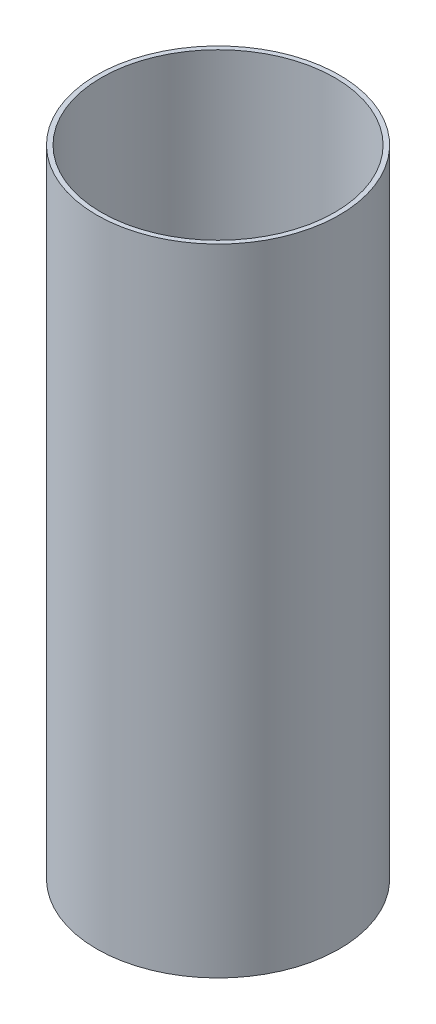
ISO-10303-21;
HEADER;
FILE_DESCRIPTION(('STEP AP214'),'2;1');
FILE_NAME('part.step','',(''),(''),'','','');
FILE_SCHEMA(('AUTOMOTIVE_DESIGN { 1 0 10303 214 1 1 1 1 }'));
ENDSEC;
DATA;
#1=APPLICATION_CONTEXT('core data for automotive mechanical design processes');
#2=APPLICATION_PROTOCOL_DEFINITION('international standard','automotive_design',2000,#1);
#3=PRODUCT_CONTEXT('',#1,'mechanical');
#4=PRODUCT('Part','Part','',(#3));
#5=PRODUCT_RELATED_PRODUCT_CATEGORY('part','',(#4));
#6=PRODUCT_DEFINITION_FORMATION('','',#4);
#7=PRODUCT_DEFINITION_CONTEXT('part definition',#1,'design');
#8=PRODUCT_DEFINITION('design','',#6,#7);
#9=PRODUCT_DEFINITION_SHAPE('','',#8);
#10=(LENGTH_UNIT() NAMED_UNIT(*) SI_UNIT(.MILLI.,.METRE.));
#11=(NAMED_UNIT(*) PLANE_ANGLE_UNIT() SI_UNIT($,.RADIAN.));
#12=(NAMED_UNIT(*) SI_UNIT($,.STERADIAN.) SOLID_ANGLE_UNIT());
#13=UNCERTAINTY_MEASURE_WITH_UNIT(LENGTH_MEASURE(1.E-05),#10,'distance_accuracy_value','');
#14=(GEOMETRIC_REPRESENTATION_CONTEXT(3) GLOBAL_UNCERTAINTY_ASSIGNED_CONTEXT((#13)) GLOBAL_UNIT_ASSIGNED_CONTEXT((#10,
#11,#12)) REPRESENTATION_CONTEXT('',''));
#15=CARTESIAN_POINT('',(0.,0.,0.));
#16=DIRECTION('',(0.,0.,1.));
#17=DIRECTION('',(1.,0.,0.));
#18=AXIS2_PLACEMENT_3D('',#15,#16,#17);
#19=CARTESIAN_POINT('',(0.,275.,0.));
#20=DIRECTION('',(0.,1.,0.));
#21=DIRECTION('',(0.,0.,1.));
#22=AXIS2_PLACEMENT_3D('',#19,#20,#21);
#23=PLANE('',#22);
#24=CARTESIAN_POINT('',(0.,275.,0.));
#25=DIRECTION('',(0.,1.,0.));
#26=DIRECTION('',(0.,0.,1.));
#27=AXIS2_PLACEMENT_3D('',#24,#25,#26);
#28=CIRCLE('',#27,52.5);
#29=CARTESIAN_POINT('',(0.,275.,52.5));
#30=VERTEX_POINT('',#29);
#31=EDGE_CURVE('E10',#30,#30,#28,.T.);
#32=ORIENTED_EDGE('',*,*,#31,.T.);
#33=EDGE_LOOP('',(#32));
#34=FACE_BOUND('',#33,.T.);
#35=CARTESIAN_POINT('',(0.,275.,0.));
#36=DIRECTION('',(0.,1.,0.));
#37=DIRECTION('',(0.,0.,1.));
#38=AXIS2_PLACEMENT_3D('',#35,#36,#37);
#39=CIRCLE('',#38,50.5);
#40=CARTESIAN_POINT('',(0.,275.,50.5));
#41=VERTEX_POINT('',#40);
#42=EDGE_CURVE('E44',#41,#41,#39,.T.);
#43=ORIENTED_EDGE('',*,*,#42,.F.);
#44=EDGE_LOOP('',(#43));
#45=FACE_BOUND('',#44,.T.);
#46=ADVANCED_FACE('F33',(#34,#45),#23,.T.);
#47=CARTESIAN_POINT('',(0.,0.,0.));
#48=DIRECTION('',(0.,1.,0.));
#49=DIRECTION('',(0.,0.,1.));
#50=AXIS2_PLACEMENT_3D('',#47,#48,#49);
#51=PLANE('',#50);
#52=CARTESIAN_POINT('',(0.,0.,0.));
#53=DIRECTION('',(0.,1.,0.));
#54=DIRECTION('',(0.,0.,1.));
#55=AXIS2_PLACEMENT_3D('',#52,#53,#54);
#56=CIRCLE('',#55,52.5);
#57=CARTESIAN_POINT('',(0.,0.,52.5));
#58=VERTEX_POINT('',#57);
#59=EDGE_CURVE('E37',#58,#58,#56,.T.);
#60=ORIENTED_EDGE('',*,*,#59,.F.);
#61=EDGE_LOOP('',(#60));
#62=FACE_BOUND('',#61,.T.);
#63=CARTESIAN_POINT('',(0.,0.,0.));
#64=DIRECTION('',(0.,1.,0.));
#65=DIRECTION('',(0.,0.,1.));
#66=AXIS2_PLACEMENT_3D('',#63,#64,#65);
#67=CIRCLE('',#66,50.5);
#68=CARTESIAN_POINT('',(0.,0.,50.5));
#69=VERTEX_POINT('',#68);
#70=EDGE_CURVE('E46',#69,#69,#67,.T.);
#71=ORIENTED_EDGE('',*,*,#70,.T.);
#72=EDGE_LOOP('',(#71));
#73=FACE_BOUND('',#72,.T.);
#74=ADVANCED_FACE('F56',(#62,#73),#51,.F.);
#75=CARTESIAN_POINT('',(0.,275.,0.));
#76=DIRECTION('',(0.,-1.,0.));
#77=DIRECTION('',(0.,0.,-1.));
#78=AXIS2_PLACEMENT_3D('',#75,#76,#77);
#79=CYLINDRICAL_SURFACE('',#78,52.5);
#80=ORIENTED_EDGE('',*,*,#31,.F.);
#81=EDGE_LOOP('',(#80));
#82=FACE_BOUND('',#81,.T.);
#83=ORIENTED_EDGE('',*,*,#59,.T.);
#84=EDGE_LOOP('',(#83));
#85=FACE_BOUND('',#84,.T.);
#86=ADVANCED_FACE('F35',(#82,#85),#79,.T.);
#87=CARTESIAN_POINT('',(0.,275.,0.));
#88=DIRECTION('',(0.,-1.,0.));
#89=DIRECTION('',(0.,0.,-1.));
#90=AXIS2_PLACEMENT_3D('',#87,#88,#89);
#91=CYLINDRICAL_SURFACE('',#90,50.5);
#92=ORIENTED_EDGE('',*,*,#42,.T.);
#93=EDGE_LOOP('',(#92));
#94=FACE_BOUND('',#93,.T.);
#95=ORIENTED_EDGE('',*,*,#70,.F.);
#96=EDGE_LOOP('',(#95));
#97=FACE_BOUND('',#96,.T.);
#98=ADVANCED_FACE('F52',(#94,#97),#91,.F.);
#99=CLOSED_SHELL('',(#46,#74,#86,#98));
#100=MANIFOLD_SOLID_BREP('B2',#99);
#101=ADVANCED_BREP_SHAPE_REPRESENTATION('',(#18,#100),#14);
#102=SHAPE_DEFINITION_REPRESENTATION(#9,#101);
ENDSEC;
END-ISO-10303-21;
